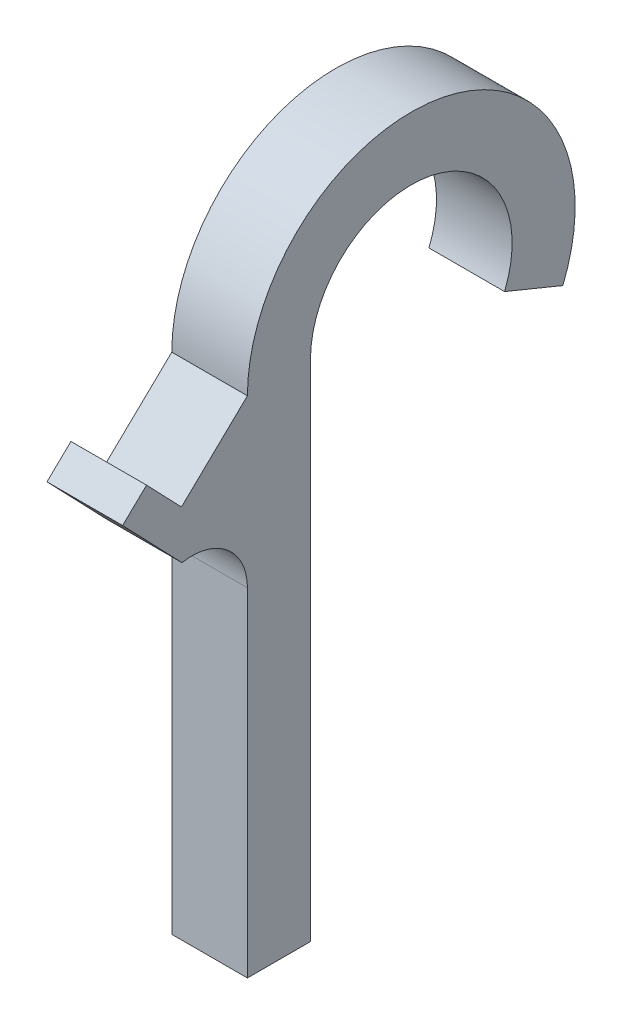
ISO-10303-21;
HEADER;
FILE_DESCRIPTION(('STEP AP214'),'2;1');
FILE_NAME('part.step','',(''),(''),'','','');
FILE_SCHEMA(('AUTOMOTIVE_DESIGN { 1 0 10303 214 1 1 1 1 }'));
ENDSEC;
DATA;
#1=APPLICATION_CONTEXT('core data for automotive mechanical design processes');
#2=APPLICATION_PROTOCOL_DEFINITION('international standard','automotive_design',2000,#1);
#3=PRODUCT_CONTEXT('',#1,'mechanical');
#4=PRODUCT('Part','Part','',(#3));
#5=PRODUCT_RELATED_PRODUCT_CATEGORY('part','',(#4));
#6=PRODUCT_DEFINITION_FORMATION('','',#4);
#7=PRODUCT_DEFINITION_CONTEXT('part definition',#1,'design');
#8=PRODUCT_DEFINITION('design','',#6,#7);
#9=PRODUCT_DEFINITION_SHAPE('','',#8);
#10=(LENGTH_UNIT() NAMED_UNIT(*) SI_UNIT(.MILLI.,.METRE.));
#11=(NAMED_UNIT(*) PLANE_ANGLE_UNIT() SI_UNIT($,.RADIAN.));
#12=(NAMED_UNIT(*) SI_UNIT($,.STERADIAN.) SOLID_ANGLE_UNIT());
#13=UNCERTAINTY_MEASURE_WITH_UNIT(LENGTH_MEASURE(1.E-05),#10,'distance_accuracy_value','');
#14=(GEOMETRIC_REPRESENTATION_CONTEXT(3) GLOBAL_UNCERTAINTY_ASSIGNED_CONTEXT((#13)) GLOBAL_UNIT_ASSIGNED_CONTEXT((#10,
#11,#12)) REPRESENTATION_CONTEXT('',''));
#15=CARTESIAN_POINT('',(0.,0.,0.));
#16=DIRECTION('',(0.,0.,1.));
#17=DIRECTION('',(1.,0.,0.));
#18=AXIS2_PLACEMENT_3D('',#15,#16,#17);
#19=CARTESIAN_POINT('',(3.81,-1.35534595934559,13.3365857883839));
#20=DIRECTION('',(0.,-0.72160242458822,-0.692307692307693));
#21=DIRECTION('',(0.,0.692307692307693,-0.72160242458822));
#22=AXIS2_PLACEMENT_3D('',#19,#20,#21);
#23=PLANE('',#22);
#24=DIRECTION('',(0.,-0.692307692307693,0.72160242458822));
#25=VECTOR('',#24,1.);
#26=CARTESIAN_POINT('',(0.,-1.35534595934559,13.3365857883839));
#27=LINE('',#26,#25);
#28=CARTESIAN_POINT('',(0.,-1.35534595934559,13.3365857883839));
#29=VERTEX_POINT('',#28);
#30=CARTESIAN_POINT('',(0.,-2.51331217878065,14.543550900602));
#31=VERTEX_POINT('',#30);
#32=EDGE_CURVE('E140',#29,#31,#27,.T.);
#33=ORIENTED_EDGE('',*,*,#32,.T.);
#34=DIRECTION('',(-1.,0.,0.));
#35=VECTOR('',#34,1.);
#36=CARTESIAN_POINT('',(3.81,-2.51331217878065,14.543550900602));
#37=LINE('',#36,#35);
#38=CARTESIAN_POINT('',(3.81,-2.51331217878065,14.543550900602));
#39=VERTEX_POINT('',#38);
#40=EDGE_CURVE('E124',#39,#31,#37,.T.);
#41=ORIENTED_EDGE('',*,*,#40,.F.);
#42=DIRECTION('',(0.,-0.692307692307693,0.72160242458822));
#43=VECTOR('',#42,1.);
#44=CARTESIAN_POINT('',(3.81,-1.35534595934559,13.3365857883839));
#45=LINE('',#44,#43);
#46=CARTESIAN_POINT('',(3.81,-1.35534595934559,13.3365857883839));
#47=VERTEX_POINT('',#46);
#48=EDGE_CURVE('E128',#47,#39,#45,.T.);
#49=ORIENTED_EDGE('',*,*,#48,.F.);
#50=DIRECTION('',(-1.,0.,0.));
#51=VECTOR('',#50,1.);
#52=CARTESIAN_POINT('',(3.81,-1.35534595934559,13.3365857883839));
#53=LINE('',#52,#51);
#54=EDGE_CURVE('E174',#47,#29,#53,.T.);
#55=ORIENTED_EDGE('',*,*,#54,.T.);
#56=EDGE_LOOP('',(#33,#41,#49,#55));
#57=FACE_BOUND('',#56,.T.);
#58=ADVANCED_FACE('F38',(#57),#23,.F.);
#59=CARTESIAN_POINT('',(3.81,-2.51331217878065,14.543550900602));
#60=DIRECTION('',(0.,0.692307692307692,-0.72160242458822));
#61=DIRECTION('',(0.,0.72160242458822,0.692307692307692));
#62=AXIS2_PLACEMENT_3D('',#59,#60,#61);
#63=PLANE('',#62);
#64=DIRECTION('',(0.,-0.72160242458822,-0.692307692307692));
#65=VECTOR('',#64,1.);
#66=CARTESIAN_POINT('',(0.,-2.51331217878065,14.543550900602));
#67=LINE('',#66,#65);
#68=CARTESIAN_POINT('',(0.,-5.62919144815258,11.5541662852174));
#69=VERTEX_POINT('',#68);
#70=EDGE_CURVE('E150',#31,#69,#67,.T.);
#71=ORIENTED_EDGE('',*,*,#70,.T.);
#72=DIRECTION('',(-1.,0.,0.));
#73=VECTOR('',#72,1.);
#74=CARTESIAN_POINT('',(3.81,-5.62919144815258,11.5541662852174));
#75=LINE('',#74,#73);
#76=CARTESIAN_POINT('',(3.81,-5.62919144815258,11.5541662852174));
#77=VERTEX_POINT('',#76);
#78=EDGE_CURVE('E126',#77,#69,#75,.T.);
#79=ORIENTED_EDGE('',*,*,#78,.F.);
#80=DIRECTION('',(0.,-0.72160242458822,-0.692307692307692));
#81=VECTOR('',#80,1.);
#82=CARTESIAN_POINT('',(3.81,-2.51331217878065,14.543550900602));
#83=LINE('',#82,#81);
#84=EDGE_CURVE('E119',#39,#77,#83,.T.);
#85=ORIENTED_EDGE('',*,*,#84,.F.);
#86=ORIENTED_EDGE('',*,*,#40,.T.);
#87=EDGE_LOOP('',(#71,#79,#85,#86));
#88=FACE_BOUND('',#87,.T.);
#89=ADVANCED_FACE('F122',(#88),#63,.F.);
#90=CARTESIAN_POINT('',(3.81,-2.46396067892183,8.25500000000004));
#91=DIRECTION('',(0.,0.,-1.));
#92=DIRECTION('',(0.,1.,0.));
#93=AXIS2_PLACEMENT_3D('',#90,#91,#92);
#94=PLANE('',#93);
#95=DIRECTION('',(0.,-1.,0.));
#96=VECTOR('',#95,1.);
#97=CARTESIAN_POINT('',(3.81,-2.46396067892183,8.25500000000004));
#98=LINE('',#97,#96);
#99=CARTESIAN_POINT('',(3.81,-8.37714396307705,8.25500000000003));
#100=VERTEX_POINT('',#99);
#101=CARTESIAN_POINT('',(3.81,-25.4,8.255));
#102=VERTEX_POINT('',#101);
#103=EDGE_CURVE('E127',#100,#102,#98,.T.);
#104=ORIENTED_EDGE('',*,*,#103,.F.);
#105=DIRECTION('',(-1.,0.,0.));
#106=VECTOR('',#105,1.);
#107=CARTESIAN_POINT('',(3.81,-8.37714396307705,8.25500000000003));
#108=LINE('',#107,#106);
#109=CARTESIAN_POINT('',(0.,-8.37714396307705,8.25500000000003));
#110=VERTEX_POINT('',#109);
#111=EDGE_CURVE('E141',#100,#110,#108,.T.);
#112=ORIENTED_EDGE('',*,*,#111,.T.);
#113=DIRECTION('',(0.,-1.,0.));
#114=VECTOR('',#113,1.);
#115=CARTESIAN_POINT('',(0.,-2.46396067892183,8.25500000000004));
#116=LINE('',#115,#114);
#117=CARTESIAN_POINT('',(0.,-25.4,8.255));
#118=VERTEX_POINT('',#117);
#119=EDGE_CURVE('E152',#110,#118,#116,.T.);
#120=ORIENTED_EDGE('',*,*,#119,.T.);
#121=DIRECTION('',(-1.,0.,0.));
#122=VECTOR('',#121,1.);
#123=CARTESIAN_POINT('',(3.81,-25.4,8.255));
#124=LINE('',#123,#122);
#125=EDGE_CURVE('E144',#102,#118,#124,.T.);
#126=ORIENTED_EDGE('',*,*,#125,.F.);
#127=EDGE_LOOP('',(#104,#112,#120,#126));
#128=FACE_BOUND('',#127,.T.);
#129=ADVANCED_FACE('F155',(#128),#94,.F.);
#130=CARTESIAN_POINT('',(3.81,-25.4,8.255));
#131=DIRECTION('',(0.,1.,0.));
#132=DIRECTION('',(0.,0.,1.));
#133=AXIS2_PLACEMENT_3D('',#130,#131,#132);
#134=PLANE('',#133);
#135=DIRECTION('',(0.,0.,-1.));
#136=VECTOR('',#135,1.);
#137=CARTESIAN_POINT('',(0.,-25.4,8.255));
#138=LINE('',#137,#136);
#139=CARTESIAN_POINT('',(0.,-25.4,5.08));
#140=VERTEX_POINT('',#139);
#141=EDGE_CURVE('E177',#118,#140,#138,.T.);
#142=ORIENTED_EDGE('',*,*,#141,.T.);
#143=DIRECTION('',(-1.,0.,0.));
#144=VECTOR('',#143,1.);
#145=CARTESIAN_POINT('',(3.81,-25.4,5.08));
#146=LINE('',#145,#144);
#147=CARTESIAN_POINT('',(3.81,-25.4,5.08));
#148=VERTEX_POINT('',#147);
#149=EDGE_CURVE('E206',#148,#140,#146,.T.);
#150=ORIENTED_EDGE('',*,*,#149,.F.);
#151=DIRECTION('',(0.,0.,-1.));
#152=VECTOR('',#151,1.);
#153=CARTESIAN_POINT('',(3.81,-25.4,8.255));
#154=LINE('',#153,#152);
#155=EDGE_CURVE('E159',#102,#148,#154,.T.);
#156=ORIENTED_EDGE('',*,*,#155,.F.);
#157=ORIENTED_EDGE('',*,*,#125,.T.);
#158=EDGE_LOOP('',(#142,#150,#156,#157));
#159=FACE_BOUND('',#158,.T.);
#160=ADVANCED_FACE('F209',(#159),#134,.F.);
#161=CARTESIAN_POINT('',(3.81,0.,5.08));
#162=DIRECTION('',(0.,0.,1.));
#163=DIRECTION('',(0.,-1.,0.));
#164=AXIS2_PLACEMENT_3D('',#161,#162,#163);
#165=PLANE('',#164);
#166=DIRECTION('',(0.,1.,0.));
#167=VECTOR('',#166,1.);
#168=CARTESIAN_POINT('',(0.,0.,5.08));
#169=LINE('',#168,#167);
#170=CARTESIAN_POINT('',(0.,0.,5.08));
#171=VERTEX_POINT('',#170);
#172=EDGE_CURVE('E179',#140,#171,#169,.T.);
#173=ORIENTED_EDGE('',*,*,#172,.T.);
#174=DIRECTION('',(-1.,0.,0.));
#175=VECTOR('',#174,1.);
#176=CARTESIAN_POINT('',(3.81,0.,5.08));
#177=LINE('',#176,#175);
#178=CARTESIAN_POINT('',(3.81,0.,5.08));
#179=VERTEX_POINT('',#178);
#180=EDGE_CURVE('E203',#179,#171,#177,.T.);
#181=ORIENTED_EDGE('',*,*,#180,.F.);
#182=DIRECTION('',(0.,1.,0.));
#183=VECTOR('',#182,1.);
#184=CARTESIAN_POINT('',(3.81,0.,5.08));
#185=LINE('',#184,#183);
#186=EDGE_CURVE('E161',#148,#179,#185,.T.);
#187=ORIENTED_EDGE('',*,*,#186,.F.);
#188=ORIENTED_EDGE('',*,*,#149,.T.);
#189=EDGE_LOOP('',(#173,#181,#187,#188));
#190=FACE_BOUND('',#189,.T.);
#191=ADVANCED_FACE('F216',(#190),#165,.F.);
#192=CARTESIAN_POINT('',(3.81,0.,0.));
#193=DIRECTION('',(-1.,0.,0.));
#194=DIRECTION('',(0.,0.,1.));
#195=AXIS2_PLACEMENT_3D('',#192,#193,#194);
#196=CYLINDRICAL_SURFACE('',#195,5.08);
#197=CARTESIAN_POINT('',(0.,0.,0.));
#198=DIRECTION('',(-1.,0.,0.));
#199=DIRECTION('',(0.,0.,-1.));
#200=AXIS2_PLACEMENT_3D('',#197,#198,#199);
#201=CIRCLE('',#200,5.08);
#202=CARTESIAN_POINT('',(0.,-1.93009797453119,-4.69905541664605));
#203=VERTEX_POINT('',#202);
#204=EDGE_CURVE('E181',#171,#203,#201,.T.);
#205=ORIENTED_EDGE('',*,*,#204,.T.);
#206=DIRECTION('',(-1.,0.,0.));
#207=VECTOR('',#206,1.);
#208=CARTESIAN_POINT('',(3.81,-1.93009797453119,-4.69905541664605));
#209=LINE('',#208,#207);
#210=CARTESIAN_POINT('',(3.81,-1.93009797453119,-4.69905541664605));
#211=VERTEX_POINT('',#210);
#212=EDGE_CURVE('E200',#211,#203,#209,.T.);
#213=ORIENTED_EDGE('',*,*,#212,.F.);
#214=CARTESIAN_POINT('',(3.81,0.,0.));
#215=DIRECTION('',(-1.,0.,0.));
#216=DIRECTION('',(0.,0.,-1.));
#217=AXIS2_PLACEMENT_3D('',#214,#215,#216);
#218=CIRCLE('',#217,5.08);
#219=EDGE_CURVE('E165',#179,#211,#218,.T.);
#220=ORIENTED_EDGE('',*,*,#219,.F.);
#221=ORIENTED_EDGE('',*,*,#180,.T.);
#222=EDGE_LOOP('',(#205,#213,#220,#221));
#223=FACE_BOUND('',#222,.T.);
#224=ADVANCED_FACE('F220',(#223),#196,.F.);
#225=CARTESIAN_POINT('',(3.81,-1.93009797453119,-4.69905541664605));
#226=DIRECTION('',(0.,0.925010908788593,-0.379940546167556));
#227=DIRECTION('',(0.,0.379940546167556,0.925010908788593));
#228=AXIS2_PLACEMENT_3D('',#225,#226,#227);
#229=PLANE('',#228);
#230=DIRECTION('',(0.,-0.379940546167556,-0.925010908788593));
#231=VECTOR('',#230,1.);
#232=CARTESIAN_POINT('',(0.,-1.93009797453119,-4.69905541664605));
#233=LINE('',#232,#231);
#234=CARTESIAN_POINT('',(0.,-3.13640920861318,-7.63596505204984));
#235=VERTEX_POINT('',#234);
#236=EDGE_CURVE('E183',#203,#235,#233,.T.);
#237=ORIENTED_EDGE('',*,*,#236,.T.);
#238=DIRECTION('',(-1.,0.,0.));
#239=VECTOR('',#238,1.);
#240=CARTESIAN_POINT('',(3.81,-3.13640920861318,-7.63596505204984));
#241=LINE('',#240,#239);
#242=CARTESIAN_POINT('',(3.81,-3.13640920861318,-7.63596505204984));
#243=VERTEX_POINT('',#242);
#244=EDGE_CURVE('E197',#243,#235,#241,.T.);
#245=ORIENTED_EDGE('',*,*,#244,.F.);
#246=DIRECTION('',(0.,-0.379940546167556,-0.925010908788593));
#247=VECTOR('',#246,1.);
#248=CARTESIAN_POINT('',(3.81,-1.93009797453119,-4.69905541664605));
#249=LINE('',#248,#247);
#250=EDGE_CURVE('E167',#211,#243,#249,.T.);
#251=ORIENTED_EDGE('',*,*,#250,.F.);
#252=ORIENTED_EDGE('',*,*,#212,.T.);
#253=EDGE_LOOP('',(#237,#245,#251,#252));
#254=FACE_BOUND('',#253,.T.);
#255=ADVANCED_FACE('F227',(#254),#229,.F.);
#256=CARTESIAN_POINT('',(3.81,0.,0.));
#257=DIRECTION('',(-1.,0.,0.));
#258=DIRECTION('',(0.,0.,1.));
#259=AXIS2_PLACEMENT_3D('',#256,#257,#258);
#260=CYLINDRICAL_SURFACE('',#259,8.255);
#261=CARTESIAN_POINT('',(0.,0.,0.));
#262=DIRECTION('',(1.,0.,0.));
#263=DIRECTION('',(0.,0.,-1.));
#264=AXIS2_PLACEMENT_3D('',#261,#262,#263);
#265=CIRCLE('',#264,8.255);
#266=CARTESIAN_POINT('',(0.,0.,8.255));
#267=VERTEX_POINT('',#266);
#268=EDGE_CURVE('E185',#235,#267,#265,.T.);
#269=ORIENTED_EDGE('',*,*,#268,.T.);
#270=DIRECTION('',(-1.,0.,0.));
#271=VECTOR('',#270,1.);
#272=CARTESIAN_POINT('',(3.81,0.,8.255));
#273=LINE('',#272,#271);
#274=CARTESIAN_POINT('',(3.81,0.,8.255));
#275=VERTEX_POINT('',#274);
#276=EDGE_CURVE('E194',#275,#267,#273,.T.);
#277=ORIENTED_EDGE('',*,*,#276,.F.);
#278=CARTESIAN_POINT('',(3.81,0.,0.));
#279=DIRECTION('',(1.,0.,0.));
#280=DIRECTION('',(0.,0.,-1.));
#281=AXIS2_PLACEMENT_3D('',#278,#279,#280);
#282=CIRCLE('',#281,8.255);
#283=EDGE_CURVE('E169',#243,#275,#282,.T.);
#284=ORIENTED_EDGE('',*,*,#283,.F.);
#285=ORIENTED_EDGE('',*,*,#244,.T.);
#286=EDGE_LOOP('',(#269,#277,#284,#285));
#287=FACE_BOUND('',#286,.T.);
#288=ADVANCED_FACE('F230',(#287),#260,.T.);
#289=CARTESIAN_POINT('',(3.81,0.,8.255));
#290=DIRECTION('',(0.,-0.72160242458822,-0.692307692307692));
#291=DIRECTION('',(0.,0.692307692307692,-0.72160242458822));
#292=AXIS2_PLACEMENT_3D('',#289,#290,#291);
#293=PLANE('',#292);
#294=DIRECTION('',(0.,-0.692307692307692,0.72160242458822));
#295=VECTOR('',#294,1.);
#296=CARTESIAN_POINT('',(0.,0.,8.255));
#297=LINE('',#296,#295);
#298=CARTESIAN_POINT('',(0.,-3.18821611779967,11.5781242499224));
#299=VERTEX_POINT('',#298);
#300=EDGE_CURVE('E187',#267,#299,#297,.T.);
#301=ORIENTED_EDGE('',*,*,#300,.T.);
#302=DIRECTION('',(-1.,0.,0.));
#303=VECTOR('',#302,1.);
#304=CARTESIAN_POINT('',(3.81,-3.18821611779967,11.5781242499224));
#305=LINE('',#304,#303);
#306=CARTESIAN_POINT('',(3.81,-3.18821611779967,11.5781242499224));
#307=VERTEX_POINT('',#306);
#308=EDGE_CURVE('E191',#307,#299,#305,.T.);
#309=ORIENTED_EDGE('',*,*,#308,.F.);
#310=DIRECTION('',(0.,-0.692307692307692,0.72160242458822));
#311=VECTOR('',#310,1.);
#312=CARTESIAN_POINT('',(3.81,0.,8.255));
#313=LINE('',#312,#311);
#314=EDGE_CURVE('E171',#275,#307,#313,.T.);
#315=ORIENTED_EDGE('',*,*,#314,.F.);
#316=ORIENTED_EDGE('',*,*,#276,.T.);
#317=EDGE_LOOP('',(#301,#309,#315,#316));
#318=FACE_BOUND('',#317,.T.);
#319=ADVANCED_FACE('F235',(#318),#293,.F.);
#320=CARTESIAN_POINT('',(3.81,-3.18821611779967,11.5781242499224));
#321=DIRECTION('',(0.,-0.692307692307692,0.72160242458822));
#322=DIRECTION('',(0.,-0.72160242458822,-0.692307692307692));
#323=AXIS2_PLACEMENT_3D('',#320,#321,#322);
#324=PLANE('',#323);
#325=DIRECTION('',(0.,0.72160242458822,0.692307692307692));
#326=VECTOR('',#325,1.);
#327=CARTESIAN_POINT('',(0.,-3.18821611779967,11.5781242499224));
#328=LINE('',#327,#326);
#329=EDGE_CURVE('E137',#299,#29,#328,.T.);
#330=ORIENTED_EDGE('',*,*,#329,.T.);
#331=ORIENTED_EDGE('',*,*,#54,.F.);
#332=DIRECTION('',(0.,0.72160242458822,0.692307692307692));
#333=VECTOR('',#332,1.);
#334=CARTESIAN_POINT('',(3.81,-3.18821611779967,11.5781242499224));
#335=LINE('',#334,#333);
#336=EDGE_CURVE('E133',#307,#47,#335,.T.);
#337=ORIENTED_EDGE('',*,*,#336,.F.);
#338=ORIENTED_EDGE('',*,*,#308,.T.);
#339=EDGE_LOOP('',(#330,#331,#337,#338));
#340=FACE_BOUND('',#339,.T.);
#341=ADVANCED_FACE('F238',(#340),#324,.F.);
#342=CARTESIAN_POINT('',(3.81,0.,0.));
#343=DIRECTION('',(1.,0.,0.));
#344=DIRECTION('',(0.,0.,-1.));
#345=AXIS2_PLACEMENT_3D('',#342,#343,#344);
#346=PLANE('',#345);
#347=ORIENTED_EDGE('',*,*,#48,.T.);
#348=ORIENTED_EDGE('',*,*,#84,.T.);
#349=CARTESIAN_POINT('',(3.81,-8.37714396307705,11.049));
#350=DIRECTION('',(1.,0.,0.));
#351=DIRECTION('',(0.,0.,-1.));
#352=AXIS2_PLACEMENT_3D('',#349,#350,#351);
#353=CIRCLE('',#352,2.794);
#354=EDGE_CURVE('E11',#77,#100,#353,.F.);
#355=ORIENTED_EDGE('',*,*,#354,.T.);
#356=ORIENTED_EDGE('',*,*,#103,.T.);
#357=ORIENTED_EDGE('',*,*,#155,.T.);
#358=ORIENTED_EDGE('',*,*,#186,.T.);
#359=ORIENTED_EDGE('',*,*,#219,.T.);
#360=ORIENTED_EDGE('',*,*,#250,.T.);
#361=ORIENTED_EDGE('',*,*,#283,.T.);
#362=ORIENTED_EDGE('',*,*,#314,.T.);
#363=ORIENTED_EDGE('',*,*,#336,.T.);
#364=EDGE_LOOP('',(#347,#348,#355,#356,#357,#358,#359,#360,#361,#362,#363));
#365=FACE_BOUND('',#364,.T.);
#366=ADVANCED_FACE('F131',(#365),#346,.T.);
#367=CARTESIAN_POINT('',(0.,0.,0.));
#368=DIRECTION('',(1.,0.,0.));
#369=DIRECTION('',(0.,0.,-1.));
#370=AXIS2_PLACEMENT_3D('',#367,#368,#369);
#371=PLANE('',#370);
#372=ORIENTED_EDGE('',*,*,#32,.F.);
#373=ORIENTED_EDGE('',*,*,#329,.F.);
#374=ORIENTED_EDGE('',*,*,#300,.F.);
#375=ORIENTED_EDGE('',*,*,#268,.F.);
#376=ORIENTED_EDGE('',*,*,#236,.F.);
#377=ORIENTED_EDGE('',*,*,#204,.F.);
#378=ORIENTED_EDGE('',*,*,#172,.F.);
#379=ORIENTED_EDGE('',*,*,#141,.F.);
#380=ORIENTED_EDGE('',*,*,#119,.F.);
#381=CARTESIAN_POINT('',(0.,-8.37714396307705,11.049));
#382=DIRECTION('',(1.,0.,0.));
#383=DIRECTION('',(0.,0.,-1.));
#384=AXIS2_PLACEMENT_3D('',#381,#382,#383);
#385=CIRCLE('',#384,2.794);
#386=EDGE_CURVE('E46',#110,#69,#385,.T.);
#387=ORIENTED_EDGE('',*,*,#386,.T.);
#388=ORIENTED_EDGE('',*,*,#70,.F.);
#389=EDGE_LOOP('',(#372,#373,#374,#375,#376,#377,#378,#379,#380,#387,#388));
#390=FACE_BOUND('',#389,.T.);
#391=ADVANCED_FACE('F149',(#390),#371,.F.);
#392=CARTESIAN_POINT('',(3.81,-8.37714396307705,11.049));
#393=DIRECTION('',(-1.,0.,0.));
#394=DIRECTION('',(0.,0.,1.));
#395=AXIS2_PLACEMENT_3D('',#392,#393,#394);
#396=CYLINDRICAL_SURFACE('',#395,2.794);
#397=ORIENTED_EDGE('',*,*,#354,.F.);
#398=ORIENTED_EDGE('',*,*,#78,.T.);
#399=ORIENTED_EDGE('',*,*,#386,.F.);
#400=ORIENTED_EDGE('',*,*,#111,.F.);
#401=EDGE_LOOP('',(#397,#398,#399,#400));
#402=FACE_BOUND('',#401,.T.);
#403=ADVANCED_FACE('F40',(#402),#396,.F.);
#404=CLOSED_SHELL('',(#58,#89,#129,#160,#191,#224,#255,#288,#319,#341,#366,#391,#403));
#405=MANIFOLD_SOLID_BREP('B2',#404);
#406=ADVANCED_BREP_SHAPE_REPRESENTATION('',(#18,#405),#14);
#407=SHAPE_DEFINITION_REPRESENTATION(#9,#406);
ENDSEC;
END-ISO-10303-21;
